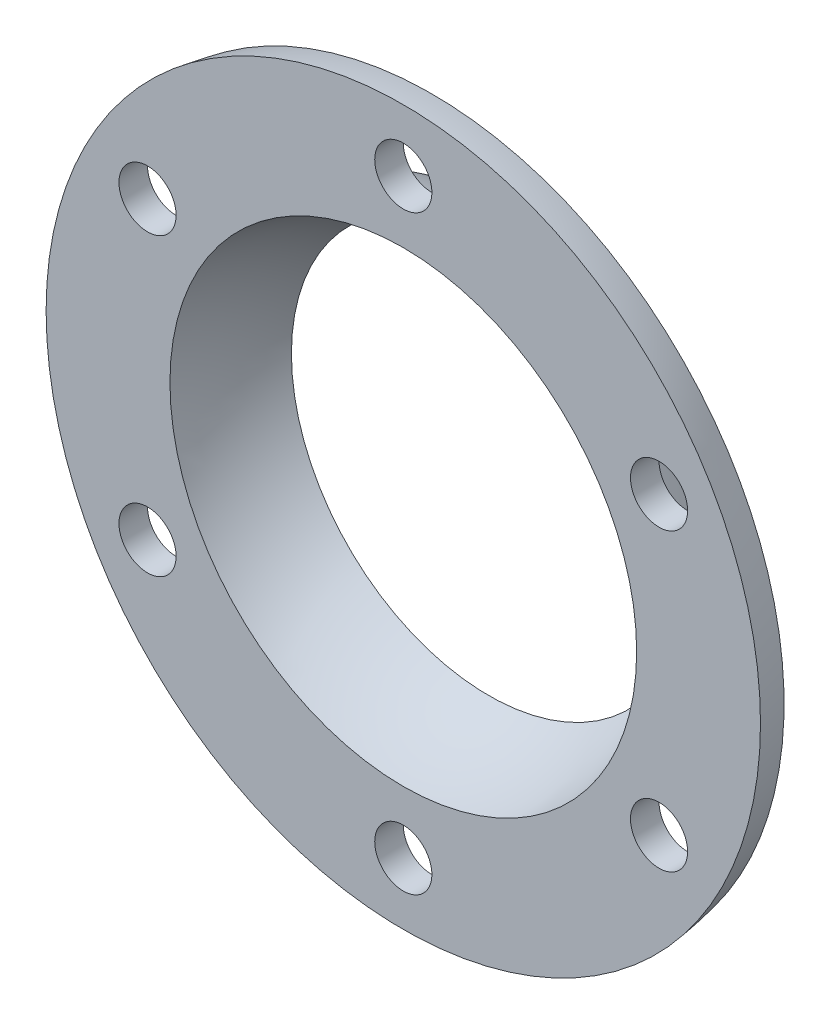
ISO-10303-21;
HEADER;
FILE_DESCRIPTION(('STEP AP214'),'2;1');
FILE_NAME('part.step','',(''),(''),'','','');
FILE_SCHEMA(('AUTOMOTIVE_DESIGN { 1 0 10303 214 1 1 1 1 }'));
ENDSEC;
DATA;
#1=APPLICATION_CONTEXT('core data for automotive mechanical design processes');
#2=APPLICATION_PROTOCOL_DEFINITION('international standard','automotive_design',2000,#1);
#3=PRODUCT_CONTEXT('',#1,'mechanical');
#4=PRODUCT('Part','Part','',(#3));
#5=PRODUCT_RELATED_PRODUCT_CATEGORY('part','',(#4));
#6=PRODUCT_DEFINITION_FORMATION('','',#4);
#7=PRODUCT_DEFINITION_CONTEXT('part definition',#1,'design');
#8=PRODUCT_DEFINITION('design','',#6,#7);
#9=PRODUCT_DEFINITION_SHAPE('','',#8);
#10=(LENGTH_UNIT() NAMED_UNIT(*) SI_UNIT(.MILLI.,.METRE.));
#11=(NAMED_UNIT(*) PLANE_ANGLE_UNIT() SI_UNIT($,.RADIAN.));
#12=(NAMED_UNIT(*) SI_UNIT($,.STERADIAN.) SOLID_ANGLE_UNIT());
#13=UNCERTAINTY_MEASURE_WITH_UNIT(LENGTH_MEASURE(1.E-05),#10,'distance_accuracy_value','');
#14=(GEOMETRIC_REPRESENTATION_CONTEXT(3) GLOBAL_UNCERTAINTY_ASSIGNED_CONTEXT((#13)) GLOBAL_UNIT_ASSIGNED_CONTEXT((#10,
#11,#12)) REPRESENTATION_CONTEXT('',''));
#15=CARTESIAN_POINT('',(0.,0.,0.));
#16=DIRECTION('',(0.,0.,1.));
#17=DIRECTION('',(1.,0.,0.));
#18=AXIS2_PLACEMENT_3D('',#15,#16,#17);
#19=CARTESIAN_POINT('',(0.,0.,4.95516454657042));
#20=DIRECTION('',(0.,0.,-1.));
#21=DIRECTION('',(-1.,0.,0.));
#22=AXIS2_PLACEMENT_3D('',#19,#20,#21);
#23=DEGENERATE_TOROIDAL_SURFACE('',#22,0.207206351916206,37.6154962941672,.T.);
#24=CARTESIAN_POINT('',(0.,0.,-3.));
#25=DIRECTION('',(0.,0.,-1.));
#26=DIRECTION('',(-1.,0.,0.));
#27=AXIS2_PLACEMENT_3D('',#24,#25,#26);
#28=CIRCLE('',#27,36.9718757845861);
#29=CARTESIAN_POINT('',(-36.9718757845861,0.,-3.));
#30=VERTEX_POINT('',#29);
#31=EDGE_CURVE('E10',#30,#30,#28,.T.);
#32=ORIENTED_EDGE('',*,*,#31,.F.);
#33=EDGE_LOOP('',(#32));
#34=FACE_BOUND('',#33,.T.);
#35=CARTESIAN_POINT('',(0.,0.,0.));
#36=DIRECTION('',(0.,0.,-1.));
#37=DIRECTION('',(-1.,0.,0.));
#38=AXIS2_PLACEMENT_3D('',#35,#36,#37);
#39=CIRCLE('',#38,37.4948974278318);
#40=CARTESIAN_POINT('',(-37.4948974278318,0.,0.));
#41=VERTEX_POINT('',#40);
#42=EDGE_CURVE('E59',#41,#41,#39,.T.);
#43=ORIENTED_EDGE('',*,*,#42,.T.);
#44=EDGE_LOOP('',(#43));
#45=FACE_BOUND('',#44,.T.);
#46=ADVANCED_FACE('F37',(#34,#45),#23,.T.);
#47=CARTESIAN_POINT('',(26.8328157299975,0.,-3.));
#48=DIRECTION('',(0.,0.,1.));
#49=DIRECTION('',(1.,0.,0.));
#50=AXIS2_PLACEMENT_3D('',#47,#48,#49);
#51=PLANE('',#50);
#52=CARTESIAN_POINT('',(26.8467875173174,15.5000000000003,-3.));
#53=DIRECTION('',(0.,0.,-1.));
#54=DIRECTION('',(-0.50000000000001,0.866025403784433,0.));
#55=AXIS2_PLACEMENT_3D('',#52,#53,#54);
#56=CIRCLE('',#55,3.);
#57=CARTESIAN_POINT('',(25.3467875173174,18.0980762113536,-3.));
#58=VERTEX_POINT('',#57);
#59=EDGE_CURVE('E188',#58,#58,#56,.T.);
#60=ORIENTED_EDGE('',*,*,#59,.F.);
#61=EDGE_LOOP('',(#60));
#62=FACE_BOUND('',#61,.T.);
#63=CARTESIAN_POINT('',(26.8467875173177,-15.4999999999997,-3.));
#64=DIRECTION('',(0.,0.,-1.));
#65=DIRECTION('',(0.499999999999992,0.866025403784443,0.));
#66=AXIS2_PLACEMENT_3D('',#63,#64,#65);
#67=CIRCLE('',#66,3.);
#68=CARTESIAN_POINT('',(28.3467875173177,-12.9019237886464,-3.));
#69=VERTEX_POINT('',#68);
#70=EDGE_CURVE('E183',#69,#69,#67,.T.);
#71=ORIENTED_EDGE('',*,*,#70,.F.);
#72=EDGE_LOOP('',(#71));
#73=FACE_BOUND('',#72,.T.);
#74=CARTESIAN_POINT('',(0.,-31.,-3.));
#75=DIRECTION('',(0.,0.,-1.));
#76=DIRECTION('',(1.,0.,0.));
#77=AXIS2_PLACEMENT_3D('',#74,#75,#76);
#78=CIRCLE('',#77,3.);
#79=CARTESIAN_POINT('',(3.,-31.,-3.));
#80=VERTEX_POINT('',#79);
#81=EDGE_CURVE('E177',#80,#80,#78,.T.);
#82=ORIENTED_EDGE('',*,*,#81,.F.);
#83=EDGE_LOOP('',(#82));
#84=FACE_BOUND('',#83,.T.);
#85=CARTESIAN_POINT('',(-26.8467875173175,-15.5000000000001,-3.));
#86=DIRECTION('',(0.,0.,-1.));
#87=DIRECTION('',(0.500000000000004,-0.866025403784436,0.));
#88=AXIS2_PLACEMENT_3D('',#85,#86,#87);
#89=CIRCLE('',#88,3.);
#90=CARTESIAN_POINT('',(-25.3467875173175,-18.0980762113534,-3.));
#91=VERTEX_POINT('',#90);
#92=EDGE_CURVE('E159',#91,#91,#89,.T.);
#93=ORIENTED_EDGE('',*,*,#92,.F.);
#94=EDGE_LOOP('',(#93));
#95=FACE_BOUND('',#94,.T.);
#96=CARTESIAN_POINT('',(-26.8467875173176,15.4999999999999,-3.));
#97=DIRECTION('',(0.,0.,-1.));
#98=DIRECTION('',(-0.499999999999998,-0.86602540378444,0.));
#99=AXIS2_PLACEMENT_3D('',#96,#97,#98);
#100=CIRCLE('',#99,3.);
#101=CARTESIAN_POINT('',(-28.3467875173176,12.9019237886466,-3.));
#102=VERTEX_POINT('',#101);
#103=EDGE_CURVE('E66',#102,#102,#100,.T.);
#104=ORIENTED_EDGE('',*,*,#103,.F.);
#105=EDGE_LOOP('',(#104));
#106=FACE_BOUND('',#105,.T.);
#107=CARTESIAN_POINT('',(0.,31.,-3.));
#108=DIRECTION('',(0.,0.,-1.));
#109=DIRECTION('',(-1.,0.,0.));
#110=AXIS2_PLACEMENT_3D('',#107,#108,#109);
#111=CIRCLE('',#110,3.);
#112=CARTESIAN_POINT('',(-3.,31.,-3.));
#113=VERTEX_POINT('',#112);
#114=EDGE_CURVE('E60',#113,#113,#111,.T.);
#115=ORIENTED_EDGE('',*,*,#114,.F.);
#116=EDGE_LOOP('',(#115));
#117=FACE_BOUND('',#116,.T.);
#118=CARTESIAN_POINT('',(0.,0.,-3.));
#119=DIRECTION('',(0.,0.,-1.));
#120=DIRECTION('',(-1.,0.,0.));
#121=AXIS2_PLACEMENT_3D('',#118,#119,#120);
#122=CIRCLE('',#121,26.8328157299975);
#123=CARTESIAN_POINT('',(26.8328157299975,0.,-3.));
#124=VERTEX_POINT('',#123);
#125=EDGE_CURVE('E45',#124,#124,#122,.T.);
#126=ORIENTED_EDGE('',*,*,#125,.F.);
#127=EDGE_LOOP('',(#126));
#128=FACE_BOUND('',#127,.T.);
#129=ORIENTED_EDGE('',*,*,#31,.T.);
#130=EDGE_LOOP('',(#129));
#131=FACE_BOUND('',#130,.T.);
#132=ADVANCED_FACE('F109',(#62,#73,#84,#95,#106,#117,#128,#131),#51,.F.);
#133=CARTESIAN_POINT('',(0.,0.,5.));
#134=DIRECTION('',(0.,0.,-1.));
#135=DIRECTION('',(1.,0.,0.));
#136=AXIS2_PLACEMENT_3D('',#133,#134,#135);
#137=SPHERICAL_SURFACE('',#136,28.);
#138=CARTESIAN_POINT('',(0.,0.,-8.97955742858139));
#139=DIRECTION('',(0.,0.,-1.));
#140=DIRECTION('',(-1.,0.,0.));
#141=AXIS2_PLACEMENT_3D('',#138,#139,#140);
#142=CIRCLE('',#141,24.2605023464271);
#143=CARTESIAN_POINT('',(24.2605023464271,0.,-8.97955742858139));
#144=VERTEX_POINT('',#143);
#145=EDGE_CURVE('E51',#144,#144,#142,.T.);
#146=CARTESIAN_POINT('',(24.2605023464271,0.,-8.97955742858139));
#147=CARTESIAN_POINT('',(24.2944325190443,0.,-8.92067409806832));
#148=CARTESIAN_POINT('',(24.328148307579,0.,-8.86166723371877));
#149=CARTESIAN_POINT('',(24.3951493469322,0.,-8.74340957598992));
#150=CARTESIAN_POINT('',(24.4284345977507,0.,-8.68415878261062));
#151=CARTESIAN_POINT('',(24.4945727921205,0.,-8.56541640546546));
#152=CARTESIAN_POINT('',(24.5274257356718,0.,-8.50592482169961));
#153=CARTESIAN_POINT('',(24.5926975749925,0.,-8.38670401865614));
#154=CARTESIAN_POINT('',(24.625116470762,0.,-8.32697479937853));
#155=CARTESIAN_POINT('',(24.689518495378,0.,-8.20728189185686));
#156=CARTESIAN_POINT('',(24.7215016242246,0.,-8.14731820361281));
#157=CARTESIAN_POINT('',(24.7850304193966,0.,-8.02715953738348));
#158=CARTESIAN_POINT('',(24.8165760857221,0.,-7.96696455939822));
#159=CARTESIAN_POINT('',(24.8792282833296,0.,-7.84634650510766));
#160=CARTESIAN_POINT('',(24.9103348146116,0.,-7.78592342880236));
#161=CARTESIAN_POINT('',(24.9721070929235,0.,-7.66485238140416));
#162=CARTESIAN_POINT('',(25.0027728399533,0.,-7.60420441031125));
#163=CARTESIAN_POINT('',(25.0636619239133,0.,-7.48268678878899));
#164=CARTESIAN_POINT('',(25.0938852608435,0.,-7.42181713835964));
#165=CARTESIAN_POINT('',(25.1538879222148,0.,-7.29985938537001));
#166=CARTESIAN_POINT('',(25.183667246656,0.,-7.23877128280973));
#167=CARTESIAN_POINT('',(25.2427803042,0.,-7.11637986434537));
#168=CARTESIAN_POINT('',(25.2721140373029,0.,-7.0550765484413));
#169=CARTESIAN_POINT('',(25.3303343569459,0.,-6.93225795348681));
#170=CARTESIAN_POINT('',(25.359220943486,0.,-6.87074267443641));
#171=CARTESIAN_POINT('',(25.4165454384856,0.,-6.74750341462463));
#172=CARTESIAN_POINT('',(25.4449833469452,0.,-6.68577943386327));
#173=CARTESIAN_POINT('',(25.5014089780545,0.,-6.56212604312996));
#174=CARTESIAN_POINT('',(25.5293967007041,0.,-6.50019663315801));
#175=CARTESIAN_POINT('',(25.5849204763321,0.,-6.37613566739544));
#176=CARTESIAN_POINT('',(25.6124565293103,0.,-6.31400411160481));
#177=CARTESIAN_POINT('',(25.6670755056809,0.,-6.18954214831419));
#178=CARTESIAN_POINT('',(25.6941584290731,0.,-6.12721174081419));
#179=CARTESIAN_POINT('',(25.7478697103811,0.,-6.00235537875692));
#180=CARTESIAN_POINT('',(25.7744980682969,0.,-5.93982942419965));
#181=CARTESIAN_POINT('',(25.8272988068616,0.,-5.8145852830475));
#182=CARTESIAN_POINT('',(25.8534711875106,0.,-5.75186709645262));
#183=CARTESIAN_POINT('',(25.9053585839269,0.,-5.62624181643676));
#184=CARTESIAN_POINT('',(25.9310735996941,0.,-5.56333472301576));
#185=CARTESIAN_POINT('',(25.9820449029804,0.,-5.43733496457465));
#186=CARTESIAN_POINT('',(26.0073011904995,0.,-5.37424229955454));
#187=CARTESIAN_POINT('',(26.0573536982441,0.,-5.24787474298089));
#188=CARTESIAN_POINT('',(26.0821499184697,0.,-5.18459985142735));
#189=CARTESIAN_POINT('',(26.1312809769739,0.,-5.05787119651389));
#190=CARTESIAN_POINT('',(26.1556158152526,0.,-4.99441743315396));
#191=CARTESIAN_POINT('',(26.2038228196713,0.,-4.86733439883822));
#192=CARTESIAN_POINT('',(26.2276949858113,0.,-4.8037051278824));
#193=CARTESIAN_POINT('',(26.2749753802913,0.,-4.67627445189055));
#194=CARTESIAN_POINT('',(26.2983836086313,0.,-4.61247304685451));
#195=CARTESIAN_POINT('',(26.3447348864461,0.,-4.48470148534394));
#196=CARTESIAN_POINT('',(26.367677935921,0.,-4.4207313288694));
#197=CARTESIAN_POINT('',(26.4130976396063,0.,-4.29262565607123));
#198=CARTESIAN_POINT('',(26.4355742938167,0.,-4.22849013974759));
#199=CARTESIAN_POINT('',(26.4800600152917,0.,-4.10005714760486));
#200=CARTESIAN_POINT('',(26.5020690825563,0.,-4.03575967178577));
#201=CARTESIAN_POINT('',(26.5456184632839,0.,-3.90700616960321));
#202=CARTESIAN_POINT('',(26.5671587767468,0.,-3.84255014323975));
#203=CARTESIAN_POINT('',(26.6097695077381,0.,-3.71348295728601));
#204=CARTESIAN_POINT('',(26.6308399252666,0.,-3.64887179769574));
#205=CARTESIAN_POINT('',(26.6725097476519,0.,-3.51949777097859));
#206=CARTESIAN_POINT('',(26.6931091525089,0.,-3.45473490385171));
#207=CARTESIAN_POINT('',(26.7338358559854,0.,-3.3250608952435));
#208=CARTESIAN_POINT('',(26.7539631546049,0.,-3.26014975376218));
#209=CARTESIAN_POINT('',(26.793744583793,0.,-3.130182639546));
#210=CARTESIAN_POINT('',(26.8133987143614,0.,-3.06512666681115));
#211=CARTESIAN_POINT('',(26.8328157299975,0.,-3.));
#212=B_SPLINE_CURVE_WITH_KNOTS('',3,(#146,#147,#148,#149,#150,#151,#152,#153,#154,#155,#156,
#157,#158,#159,#160,#161,#162,#163,#164,#165,#166,#167,#168,#169,#170,#171,#172,#173,#174,#175,
#176,#177,#178,#179,#180,#181,#182,#183,#184,#185,#186,#187,#188,#189,#190,#191,#192,#193,#194,
#195,#196,#197,#198,#199,#200,#201,#202,#203,#204,#205,#206,#207,#208,#209,#210,#211),
.UNSPECIFIED.,.F.,.F.,(4,2,2,2,2,2,2,2,2,2,2,2,2,2,2,2,2,2,2,2,2,2,2,2,2,2,2,2,2,2,2,2,4),(0.,
0.203878261090416,0.407756522180835,0.611634783271254,0.815513044361668,1.01939130545208,
1.2232695665425,1.42714782763292,1.63102608872334,1.83490434981375,2.03878261090417,
2.24266087199459,2.446539133085,2.65041739417542,2.85429565526584,3.05817391635626,
3.26205217744667,3.46593043853709,3.66980869962751,3.87368696071792,4.07756522180834,
4.28144348289876,4.48532174398917,4.68920000507959,4.89307826617001,5.09695652726043,
5.30083478835084,5.50471304944126,5.70859131053168,5.91246957162209,6.11634783271251,
6.32022609380293,6.52410435489334),.UNSPECIFIED.);
#213=EDGE_CURVE('BSEAM106',#144,#124,#212,.T.);
#214=ORIENTED_EDGE('',*,*,#145,.F.);
#215=ORIENTED_EDGE('',*,*,#125,.T.);
#216=ORIENTED_EDGE('',*,*,#213,.T.);
#217=ORIENTED_EDGE('',*,*,#213,.F.);
#218=EDGE_LOOP('',(#214,#216,#215,#217));
#219=FACE_BOUND('',#218,.T.);
#220=ADVANCED_FACE('F106',(#219),#137,.T.);
#221=CARTESIAN_POINT('',(0.,0.,-8.97955742858139));
#222=DIRECTION('',(0.,0.,1.));
#223=DIRECTION('',(1.,0.,0.));
#224=AXIS2_PLACEMENT_3D('',#221,#222,#223);
#225=CONICAL_SURFACE('',#224,24.2605023464271,1.57060139346282);
#226=CARTESIAN_POINT('',(0.,0.,-8.98024648847711));
#227=DIRECTION('',(0.,0.,-1.));
#228=DIRECTION('',(-1.,0.,0.));
#229=AXIS2_PLACEMENT_3D('',#226,#227,#228);
#230=CIRCLE('',#229,20.7256533822561);
#231=CARTESIAN_POINT('',(20.7256533822561,0.,-8.98024648847711));
#232=VERTEX_POINT('',#231);
#233=EDGE_CURVE('E97',#232,#232,#230,.T.);
#234=ORIENTED_EDGE('',*,*,#233,.F.);
#235=EDGE_LOOP('',(#234));
#236=FACE_BOUND('',#235,.T.);
#237=ORIENTED_EDGE('',*,*,#145,.T.);
#238=EDGE_LOOP('',(#237));
#239=FACE_BOUND('',#238,.T.);
#240=ADVANCED_FACE('F104',(#236,#239),#225,.T.);
#241=CARTESIAN_POINT('',(0.,0.,5.));
#242=DIRECTION('',(0.,0.,-1.));
#243=DIRECTION('',(1.,0.,0.));
#244=AXIS2_PLACEMENT_3D('',#241,#242,#243);
#245=SPHERICAL_SURFACE('',#244,25.);
#246=CARTESIAN_POINT('',(0.,0.,0.));
#247=DIRECTION('',(0.,0.,-1.));
#248=DIRECTION('',(-1.,0.,0.));
#249=AXIS2_PLACEMENT_3D('',#246,#247,#248);
#250=CIRCLE('',#249,24.4948974278318);
#251=CARTESIAN_POINT('',(24.4948974278318,0.,0.));
#252=VERTEX_POINT('',#251);
#253=EDGE_CURVE('E93',#252,#252,#250,.T.);
#254=CARTESIAN_POINT('',(24.4948974278318,0.,0.));
#255=CARTESIAN_POINT('',(24.4744769150731,0.,-0.100039841681573));
#256=CARTESIAN_POINT('',(24.4534434771642,0.,-0.199954569810435));
#257=CARTESIAN_POINT('',(24.4101540532789,0.,-0.399518831396076));
#258=CARTESIAN_POINT('',(24.3878980673024,0.,-0.499168364852856));
#259=CARTESIAN_POINT('',(24.3421668495147,0.,-0.698187269527675));
#260=CARTESIAN_POINT('',(24.3186916177034,0.,-0.797556640745714));
#261=CARTESIAN_POINT('',(24.2705254426845,0.,-0.996000306100852));
#262=CARTESIAN_POINT('',(24.245834499477,0.,-1.09507460023795));
#263=CARTESIAN_POINT('',(24.1952406054275,0.,-1.29291323802703));
#264=CARTESIAN_POINT('',(24.1693376545856,0.,-1.39167758167901));
#265=CARTESIAN_POINT('',(24.1163236345036,0.,-1.58888149238858));
#266=CARTESIAN_POINT('',(24.0892125652634,0.,-1.68732105944617));
#267=CARTESIAN_POINT('',(24.0337863780351,0.,-1.88386063940717));
#268=CARTESIAN_POINT('',(24.0054712600469,0.,-1.98196065231059));
#269=CARTESIAN_POINT('',(23.9476412259748,0.,-2.1778063974315));
#270=CARTESIAN_POINT('',(23.9181263098909,0.,-2.27555212964901));
#271=CARTESIAN_POINT('',(23.8579011103231,0.,-2.47067464003543));
#272=CARTESIAN_POINT('',(23.8271908268392,0.,-2.56805141820435));
#273=CARTESIAN_POINT('',(23.7645795026305,0.,-2.76242140252139));
#274=CARTESIAN_POINT('',(23.7326784619059,0.,-2.85941460866951));
#275=CARTESIAN_POINT('',(23.667690412124,0.,-3.05300288855259));
#276=CARTESIAN_POINT('',(23.6346034030669,0.,-3.14959796228757));
#277=CARTESIAN_POINT('',(23.5672483835644,0.,-3.342375476719));
#278=CARTESIAN_POINT('',(23.532980373119,0.,-3.43855791741547));
#279=CARTESIAN_POINT('',(23.4632684950733,0.,-3.63049572708797));
#280=CARTESIAN_POINT('',(23.4278246274729,0.,-3.726251096064));
#281=CARTESIAN_POINT('',(23.355766355867,0.,-3.91732038772471));
#282=CARTESIAN_POINT('',(23.3191519518617,0.,-4.0126343104094));
#283=CARTESIAN_POINT('',(23.2447581039142,0.,-4.20280640118538));
#284=CARTESIAN_POINT('',(23.2069786599721,0.,-4.29766456927669));
#285=CARTESIAN_POINT('',(23.1302604035125,0.,-4.48691091098069));
#286=CARTESIAN_POINT('',(23.091321590995,0.,-4.58129908459338));
#287=CARTESIAN_POINT('',(23.0122904427877,0.,-4.7695912680094));
#288=CARTESIAN_POINT('',(22.9721981070978,0.,-4.86349527781273));
#289=CARTESIAN_POINT('',(22.8908659311129,0.,-5.0508050369608));
#290=CARTESIAN_POINT('',(22.8496260908179,0.,-5.14421078630553));
#291=CARTESIAN_POINT('',(22.7660050964505,0.,-5.33051000268487));
#292=CARTESIAN_POINT('',(22.7236239423782,0.,-5.42340346971947));
#293=CARTESIAN_POINT('',(22.6377266826154,0.,-5.60866417652963));
#294=CARTESIAN_POINT('',(22.594210576925,0.,-5.70103141630519));
#295=CARTESIAN_POINT('',(22.5060499464617,0.,-5.88522580264431));
#296=CARTESIAN_POINT('',(22.4614054216887,0.,-5.97705294920789));
#297=CARTESIAN_POINT('',(22.3709946549914,0.,-6.16015336424769));
#298=CARTESIAN_POINT('',(22.325228413067,0.,-6.25142663272392));
#299=CARTESIAN_POINT('',(22.2325810823874,0.,-6.43340558986037));
#300=CARTESIAN_POINT('',(22.185699993632,0.,-6.52411127852058));
#301=CARTESIAN_POINT('',(22.0908300069702,0.,-6.7049414595008));
#302=CARTESIAN_POINT('',(22.0428411090636,0.,-6.7950659518208));
#303=CARTESIAN_POINT('',(21.9457627080765,0.,-6.97472021084149));
#304=CARTESIAN_POINT('',(21.896673204996,0.,-7.06424997754217));
#305=CARTESIAN_POINT('',(21.797400962874,0.,-7.24270134533415));
#306=CARTESIAN_POINT('',(21.7472182238326,0.,-7.33162294642544));
#307=CARTESIAN_POINT('',(21.6457670430579,0.,-7.5088446342668));
#308=CARTESIAN_POINT('',(21.5944986013247,0.,-7.59714472101688));
#309=CARTESIAN_POINT('',(21.4908837116352,0.,-7.77311012488663));
#310=CARTESIAN_POINT('',(21.438537263679,0.,-7.86077544200632));
#311=CARTESIAN_POINT('',(21.3327742190313,0.,-8.03545814608481));
#312=CARTESIAN_POINT('',(21.2793576223398,0.,-8.12247553304362));
#313=CARTESIAN_POINT('',(21.1714623013769,0.,-8.29584931551905));
#314=CARTESIAN_POINT('',(21.1169835771055,0.,-8.38220571103568));
#315=CARTESIAN_POINT('',(21.006972170313,0.,-8.55424454116963));
#316=CARTESIAN_POINT('',(20.9514394877919,0.,-8.63992697578694));
#317=CARTESIAN_POINT('',(20.8393285341057,0.,-8.81060504346438));
#318=CARTESIAN_POINT('',(20.7827502629405,0.,-8.89560067652451));
#319=CARTESIAN_POINT('',(20.7256533822561,0.,-8.98024648847711));
#320=B_SPLINE_CURVE_WITH_KNOTS('',3,(#254,#255,#256,#257,#258,#259,#260,#261,#262,#263,#264,
#265,#266,#267,#268,#269,#270,#271,#272,#273,#274,#275,#276,#277,#278,#279,#280,#281,#282,#283,
#284,#285,#286,#287,#288,#289,#290,#291,#292,#293,#294,#295,#296,#297,#298,#299,#300,#301,#302,
#303,#304,#305,#306,#307,#308,#309,#310,#311,#312,#313,#314,#315,#316,#317,#318,#319),
.UNSPECIFIED.,.F.,.F.,(4,2,2,2,2,2,2,2,2,2,2,2,2,2,2,2,2,2,2,2,2,2,2,2,2,2,2,2,2,2,2,2,4),(0.,
0.306306269788477,0.612612539576955,0.918918809365432,1.22522507915391,1.53153134894239,
1.83783761873087,2.14414388851934,2.45045015830782,2.7567564280963,3.06306269788477,
3.36936896767325,3.67567523746173,3.98198150725021,4.28828777703868,4.59459404682716,
4.90090031661564,5.20720658640412,5.5135128561926,5.81981912598107,6.12612539576955,
6.43243166555803,6.7387379353465,7.04504420513498,7.35135047492346,7.65765674471194,
7.96396301450041,8.27026928428889,8.57657555407737,8.88288182386585,9.18918809365432,
9.4954943634428,9.80180063323128),.UNSPECIFIED.);
#321=EDGE_CURVE('BSEAM124',#252,#232,#320,.T.);
#322=ORIENTED_EDGE('',*,*,#253,.F.);
#323=ORIENTED_EDGE('',*,*,#233,.T.);
#324=ORIENTED_EDGE('',*,*,#321,.T.);
#325=ORIENTED_EDGE('',*,*,#321,.F.);
#326=EDGE_LOOP('',(#322,#324,#323,#325));
#327=FACE_BOUND('',#326,.T.);
#328=ADVANCED_FACE('F124',(#327),#245,.F.);
#329=CARTESIAN_POINT('',(24.4948974278318,0.,0.));
#330=DIRECTION('',(0.,0.,-1.));
#331=DIRECTION('',(-1.,0.,0.));
#332=AXIS2_PLACEMENT_3D('',#329,#330,#331);
#333=PLANE('',#332);
#334=CARTESIAN_POINT('',(26.8467875173174,15.5000000000003,0.));
#335=DIRECTION('',(0.,0.,-1.));
#336=DIRECTION('',(-1.,0.,0.));
#337=AXIS2_PLACEMENT_3D('',#334,#335,#336);
#338=CIRCLE('',#337,3.);
#339=CARTESIAN_POINT('',(23.8467875173174,15.5000000000003,0.));
#340=VERTEX_POINT('',#339);
#341=EDGE_CURVE('E40',#340,#340,#338,.T.);
#342=ORIENTED_EDGE('',*,*,#341,.T.);
#343=EDGE_LOOP('',(#342));
#344=FACE_BOUND('',#343,.T.);
#345=CARTESIAN_POINT('',(26.8467875173177,-15.4999999999997,0.));
#346=DIRECTION('',(0.,0.,-1.));
#347=DIRECTION('',(-1.,0.,0.));
#348=AXIS2_PLACEMENT_3D('',#345,#346,#347);
#349=CIRCLE('',#348,3.);
#350=CARTESIAN_POINT('',(23.8467875173177,-15.4999999999997,0.));
#351=VERTEX_POINT('',#350);
#352=EDGE_CURVE('E73',#351,#351,#349,.T.);
#353=ORIENTED_EDGE('',*,*,#352,.T.);
#354=EDGE_LOOP('',(#353));
#355=FACE_BOUND('',#354,.T.);
#356=CARTESIAN_POINT('',(0.,-31.,0.));
#357=DIRECTION('',(0.,0.,-1.));
#358=DIRECTION('',(-1.,0.,0.));
#359=AXIS2_PLACEMENT_3D('',#356,#357,#358);
#360=CIRCLE('',#359,3.);
#361=CARTESIAN_POINT('',(-3.,-31.,0.));
#362=VERTEX_POINT('',#361);
#363=EDGE_CURVE('E70',#362,#362,#360,.T.);
#364=ORIENTED_EDGE('',*,*,#363,.T.);
#365=EDGE_LOOP('',(#364));
#366=FACE_BOUND('',#365,.T.);
#367=CARTESIAN_POINT('',(-26.8467875173175,-15.5000000000001,0.));
#368=DIRECTION('',(0.,0.,-1.));
#369=DIRECTION('',(-1.,0.,0.));
#370=AXIS2_PLACEMENT_3D('',#367,#368,#369);
#371=CIRCLE('',#370,3.);
#372=CARTESIAN_POINT('',(-29.8467875173175,-15.5000000000001,0.));
#373=VERTEX_POINT('',#372);
#374=EDGE_CURVE('E65',#373,#373,#371,.T.);
#375=ORIENTED_EDGE('',*,*,#374,.T.);
#376=EDGE_LOOP('',(#375));
#377=FACE_BOUND('',#376,.T.);
#378=CARTESIAN_POINT('',(-26.8467875173176,15.4999999999999,0.));
#379=DIRECTION('',(0.,0.,-1.));
#380=DIRECTION('',(-1.,0.,0.));
#381=AXIS2_PLACEMENT_3D('',#378,#379,#380);
#382=CIRCLE('',#381,3.);
#383=CARTESIAN_POINT('',(-29.8467875173176,15.4999999999999,0.));
#384=VERTEX_POINT('',#383);
#385=EDGE_CURVE('E61',#384,#384,#382,.T.);
#386=ORIENTED_EDGE('',*,*,#385,.T.);
#387=EDGE_LOOP('',(#386));
#388=FACE_BOUND('',#387,.T.);
#389=CARTESIAN_POINT('',(0.,31.,0.));
#390=DIRECTION('',(0.,0.,-1.));
#391=DIRECTION('',(-1.,0.,0.));
#392=AXIS2_PLACEMENT_3D('',#389,#390,#391);
#393=CIRCLE('',#392,3.);
#394=CARTESIAN_POINT('',(-3.,31.,0.));
#395=VERTEX_POINT('',#394);
#396=EDGE_CURVE('E55',#395,#395,#393,.T.);
#397=ORIENTED_EDGE('',*,*,#396,.T.);
#398=EDGE_LOOP('',(#397));
#399=FACE_BOUND('',#398,.T.);
#400=ORIENTED_EDGE('',*,*,#42,.F.);
#401=EDGE_LOOP('',(#400));
#402=FACE_BOUND('',#401,.T.);
#403=ORIENTED_EDGE('',*,*,#253,.T.);
#404=EDGE_LOOP('',(#403));
#405=FACE_BOUND('',#404,.T.);
#406=ADVANCED_FACE('F128',(#344,#355,#366,#377,#388,#399,#402,#405),#333,.F.);
#407=CARTESIAN_POINT('',(0.,31.,7.));
#408=DIRECTION('',(0.,0.,-1.));
#409=DIRECTION('',(-1.,0.,0.));
#410=AXIS2_PLACEMENT_3D('',#407,#408,#409);
#411=CYLINDRICAL_SURFACE('',#410,3.);
#412=ORIENTED_EDGE('',*,*,#114,.T.);
#413=EDGE_LOOP('',(#412));
#414=FACE_BOUND('',#413,.T.);
#415=ORIENTED_EDGE('',*,*,#396,.F.);
#416=EDGE_LOOP('',(#415));
#417=FACE_BOUND('',#416,.T.);
#418=ADVANCED_FACE('F132',(#414,#417),#411,.F.);
#419=CARTESIAN_POINT('',(-26.8467875173176,15.4999999999999,7.));
#420=DIRECTION('',(0.,0.,-1.));
#421=DIRECTION('',(-1.,0.,0.));
#422=AXIS2_PLACEMENT_3D('',#419,#420,#421);
#423=CYLINDRICAL_SURFACE('',#422,3.);
#424=ORIENTED_EDGE('',*,*,#103,.T.);
#425=EDGE_LOOP('',(#424));
#426=FACE_BOUND('',#425,.T.);
#427=ORIENTED_EDGE('',*,*,#385,.F.);
#428=EDGE_LOOP('',(#427));
#429=FACE_BOUND('',#428,.T.);
#430=ADVANCED_FACE('F135',(#426,#429),#423,.F.);
#431=CARTESIAN_POINT('',(-26.8467875173175,-15.5000000000001,7.));
#432=DIRECTION('',(0.,0.,-1.));
#433=DIRECTION('',(-1.,0.,0.));
#434=AXIS2_PLACEMENT_3D('',#431,#432,#433);
#435=CYLINDRICAL_SURFACE('',#434,3.);
#436=ORIENTED_EDGE('',*,*,#92,.T.);
#437=EDGE_LOOP('',(#436));
#438=FACE_BOUND('',#437,.T.);
#439=ORIENTED_EDGE('',*,*,#374,.F.);
#440=EDGE_LOOP('',(#439));
#441=FACE_BOUND('',#440,.T.);
#442=ADVANCED_FACE('F138',(#438,#441),#435,.F.);
#443=CARTESIAN_POINT('',(0.,-31.,7.));
#444=DIRECTION('',(0.,0.,-1.));
#445=DIRECTION('',(-1.,0.,0.));
#446=AXIS2_PLACEMENT_3D('',#443,#444,#445);
#447=CYLINDRICAL_SURFACE('',#446,3.);
#448=ORIENTED_EDGE('',*,*,#81,.T.);
#449=EDGE_LOOP('',(#448));
#450=FACE_BOUND('',#449,.T.);
#451=ORIENTED_EDGE('',*,*,#363,.F.);
#452=EDGE_LOOP('',(#451));
#453=FACE_BOUND('',#452,.T.);
#454=ADVANCED_FACE('F147',(#450,#453),#447,.F.);
#455=CARTESIAN_POINT('',(26.8467875173177,-15.4999999999997,7.));
#456=DIRECTION('',(0.,0.,-1.));
#457=DIRECTION('',(-1.,0.,0.));
#458=AXIS2_PLACEMENT_3D('',#455,#456,#457);
#459=CYLINDRICAL_SURFACE('',#458,3.);
#460=ORIENTED_EDGE('',*,*,#70,.T.);
#461=EDGE_LOOP('',(#460));
#462=FACE_BOUND('',#461,.T.);
#463=ORIENTED_EDGE('',*,*,#352,.F.);
#464=EDGE_LOOP('',(#463));
#465=FACE_BOUND('',#464,.T.);
#466=ADVANCED_FACE('F143',(#462,#465),#459,.F.);
#467=CARTESIAN_POINT('',(26.8467875173174,15.5000000000003,7.));
#468=DIRECTION('',(0.,0.,-1.));
#469=DIRECTION('',(-1.,0.,0.));
#470=AXIS2_PLACEMENT_3D('',#467,#468,#469);
#471=CYLINDRICAL_SURFACE('',#470,3.);
#472=ORIENTED_EDGE('',*,*,#59,.T.);
#473=EDGE_LOOP('',(#472));
#474=FACE_BOUND('',#473,.T.);
#475=ORIENTED_EDGE('',*,*,#341,.F.);
#476=EDGE_LOOP('',(#475));
#477=FACE_BOUND('',#476,.T.);
#478=ADVANCED_FACE('F140',(#474,#477),#471,.F.);
#479=CLOSED_SHELL('',(#46,#132,#220,#240,#328,#406,#418,#430,#442,#454,#466,#478));
#480=MANIFOLD_SOLID_BREP('B2',#479);
#481=ADVANCED_BREP_SHAPE_REPRESENTATION('',(#18,#480),#14);
#482=SHAPE_DEFINITION_REPRESENTATION(#9,#481);
ENDSEC;
END-ISO-10303-21;
